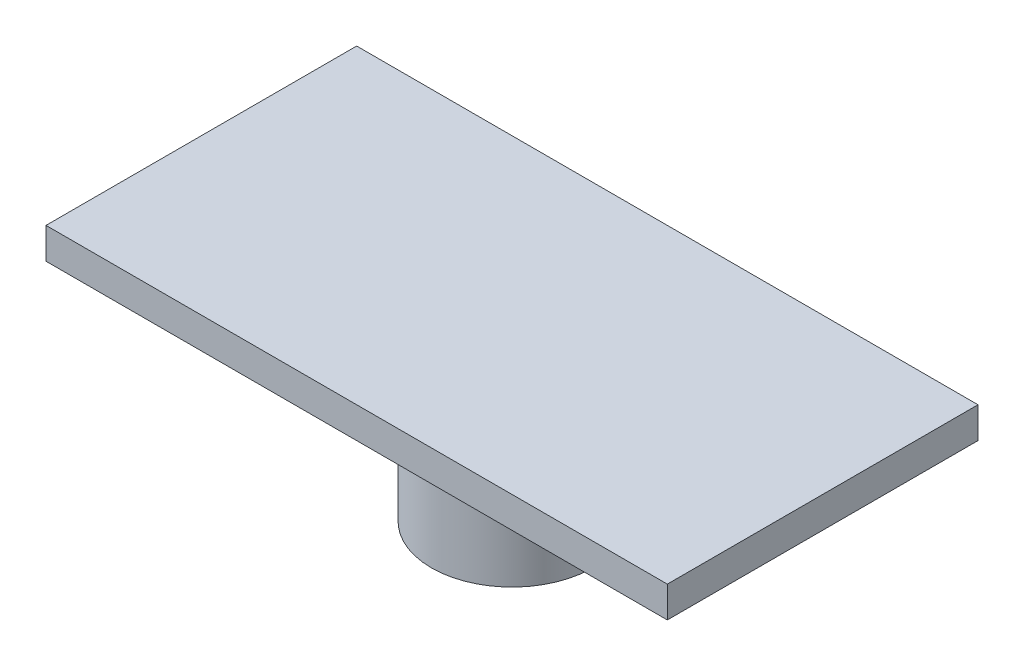
ISO-10303-21;
HEADER;
FILE_DESCRIPTION(('STEP AP214'),'2;1');
FILE_NAME('part.step','',(''),(''),'','','');
FILE_SCHEMA(('AUTOMOTIVE_DESIGN { 1 0 10303 214 1 1 1 1 }'));
ENDSEC;
DATA;
#1=APPLICATION_CONTEXT('core data for automotive mechanical design processes');
#2=APPLICATION_PROTOCOL_DEFINITION('international standard','automotive_design',2000,#1);
#3=PRODUCT_CONTEXT('',#1,'mechanical');
#4=PRODUCT('Part','Part','',(#3));
#5=PRODUCT_RELATED_PRODUCT_CATEGORY('part','',(#4));
#6=PRODUCT_DEFINITION_FORMATION('','',#4);
#7=PRODUCT_DEFINITION_CONTEXT('part definition',#1,'design');
#8=PRODUCT_DEFINITION('design','',#6,#7);
#9=PRODUCT_DEFINITION_SHAPE('','',#8);
#10=(LENGTH_UNIT() NAMED_UNIT(*) SI_UNIT(.MILLI.,.METRE.));
#11=(NAMED_UNIT(*) PLANE_ANGLE_UNIT() SI_UNIT($,.RADIAN.));
#12=(NAMED_UNIT(*) SI_UNIT($,.STERADIAN.) SOLID_ANGLE_UNIT());
#13=UNCERTAINTY_MEASURE_WITH_UNIT(LENGTH_MEASURE(1.E-05),#10,'distance_accuracy_value','');
#14=(GEOMETRIC_REPRESENTATION_CONTEXT(3) GLOBAL_UNCERTAINTY_ASSIGNED_CONTEXT((#13)) GLOBAL_UNIT_ASSIGNED_CONTEXT((#10,
#11,#12)) REPRESENTATION_CONTEXT('',''));
#15=CARTESIAN_POINT('',(0.,0.,0.));
#16=DIRECTION('',(0.,0.,1.));
#17=DIRECTION('',(1.,0.,0.));
#18=AXIS2_PLACEMENT_3D('',#15,#16,#17);
#19=CARTESIAN_POINT('',(0.,9.5,0.));
#20=DIRECTION('',(0.,-1.,0.));
#21=DIRECTION('',(0.,0.,-1.));
#22=AXIS2_PLACEMENT_3D('',#19,#20,#21);
#23=CYLINDRICAL_SURFACE('',#22,5.1893320000508);
#24=CARTESIAN_POINT('',(0.,9.5,0.));
#25=DIRECTION('',(0.,1.,0.));
#26=DIRECTION('',(0.,0.,1.));
#27=AXIS2_PLACEMENT_3D('',#24,#25,#26);
#28=CIRCLE('',#27,5.1893320000508);
#29=CARTESIAN_POINT('',(0.,9.5,5.1893320000508));
#30=VERTEX_POINT('',#29);
#31=EDGE_CURVE('E170',#30,#30,#28,.T.);
#32=ORIENTED_EDGE('',*,*,#31,.F.);
#33=EDGE_LOOP('',(#32));
#34=FACE_BOUND('',#33,.T.);
#35=CARTESIAN_POINT('',(0.,0.,0.));
#36=DIRECTION('',(0.,1.,0.));
#37=DIRECTION('',(0.,0.,1.));
#38=AXIS2_PLACEMENT_3D('',#35,#36,#37);
#39=CIRCLE('',#38,5.1893320000508);
#40=CARTESIAN_POINT('',(0.,0.,5.1893320000508));
#41=VERTEX_POINT('',#40);
#42=EDGE_CURVE('E160',#41,#41,#39,.T.);
#43=ORIENTED_EDGE('',*,*,#42,.T.);
#44=EDGE_LOOP('',(#43));
#45=FACE_BOUND('',#44,.T.);
#46=ADVANCED_FACE('F43',(#34,#45),#23,.T.);
#47=CARTESIAN_POINT('',(0.,0.,0.));
#48=DIRECTION('',(0.,1.,0.));
#49=DIRECTION('',(0.,0.,1.));
#50=AXIS2_PLACEMENT_3D('',#47,#48,#49);
#51=PLANE('',#50);
#52=CARTESIAN_POINT('',(0.874999999999995,0.,0.));
#53=DIRECTION('',(0.,1.,0.));
#54=DIRECTION('',(0.,0.,1.));
#55=AXIS2_PLACEMENT_3D('',#52,#53,#54);
#56=CIRCLE('',#55,2.29809703885628);
#57=CARTESIAN_POINT('',(2.5,0.,-1.625));
#58=VERTEX_POINT('',#57);
#59=CARTESIAN_POINT('',(2.5,0.,1.625));
#60=VERTEX_POINT('',#59);
#61=EDGE_CURVE('E51',#58,#60,#56,.F.);
#62=ORIENTED_EDGE('',*,*,#61,.F.);
#63=DIRECTION('',(-1.,0.,0.));
#64=VECTOR('',#63,1.);
#65=CARTESIAN_POINT('',(0.,0.,-1.625));
#66=LINE('',#65,#64);
#67=CARTESIAN_POINT('',(-2.5,0.,-1.625));
#68=VERTEX_POINT('',#67);
#69=EDGE_CURVE('E11',#58,#68,#66,.T.);
#70=ORIENTED_EDGE('',*,*,#69,.T.);
#71=CARTESIAN_POINT('',(-0.874999999999836,0.,0.));
#72=DIRECTION('',(0.,1.,0.));
#73=DIRECTION('',(0.,0.,1.));
#74=AXIS2_PLACEMENT_3D('',#71,#72,#73);
#75=CIRCLE('',#74,2.2980970388564);
#76=CARTESIAN_POINT('',(-2.5,0.,1.625));
#77=VERTEX_POINT('',#76);
#78=EDGE_CURVE('E174',#68,#77,#75,.T.);
#79=ORIENTED_EDGE('',*,*,#78,.T.);
#80=DIRECTION('',(-1.,0.,0.));
#81=VECTOR('',#80,1.);
#82=CARTESIAN_POINT('',(0.,0.,1.625));
#83=LINE('',#82,#81);
#84=EDGE_CURVE('E181',#60,#77,#83,.T.);
#85=ORIENTED_EDGE('',*,*,#84,.F.);
#86=EDGE_LOOP('',(#62,#70,#79,#85));
#87=FACE_BOUND('',#86,.T.);
#88=ORIENTED_EDGE('',*,*,#42,.F.);
#89=EDGE_LOOP('',(#88));
#90=FACE_BOUND('',#89,.T.);
#91=ADVANCED_FACE('F194',(#87,#90),#51,.F.);
#92=CARTESIAN_POINT('',(0.,-2.3,-1.625));
#93=DIRECTION('',(0.,0.,-1.));
#94=DIRECTION('',(-1.,0.,0.));
#95=AXIS2_PLACEMENT_3D('',#92,#93,#94);
#96=PLANE('',#95);
#97=DIRECTION('',(0.,1.,0.));
#98=VECTOR('',#97,1.);
#99=CARTESIAN_POINT('',(2.5,-2.3,-1.625));
#100=LINE('',#99,#98);
#101=CARTESIAN_POINT('',(2.5,9.5,-1.625));
#102=VERTEX_POINT('',#101);
#103=EDGE_CURVE('E157',#58,#102,#100,.T.);
#104=ORIENTED_EDGE('',*,*,#103,.T.);
#105=DIRECTION('',(-1.,0.,0.));
#106=VECTOR('',#105,1.);
#107=CARTESIAN_POINT('',(0.,9.5,-1.625));
#108=LINE('',#107,#106);
#109=CARTESIAN_POINT('',(-2.5,9.5,-1.625));
#110=VERTEX_POINT('',#109);
#111=EDGE_CURVE('E137',#102,#110,#108,.T.);
#112=ORIENTED_EDGE('',*,*,#111,.T.);
#113=DIRECTION('',(0.,1.,0.));
#114=VECTOR('',#113,1.);
#115=CARTESIAN_POINT('',(-2.5,-2.3,-1.625));
#116=LINE('',#115,#114);
#117=EDGE_CURVE('E156',#68,#110,#116,.T.);
#118=ORIENTED_EDGE('',*,*,#117,.F.);
#119=ORIENTED_EDGE('',*,*,#69,.F.);
#120=EDGE_LOOP('',(#104,#112,#118,#119));
#121=FACE_BOUND('',#120,.T.);
#122=ADVANCED_FACE('F197',(#121),#96,.F.);
#123=CARTESIAN_POINT('',(0.874999999999995,-2.3,0.));
#124=DIRECTION('',(0.,1.,0.));
#125=DIRECTION('',(0.,0.,1.));
#126=AXIS2_PLACEMENT_3D('',#123,#124,#125);
#127=CYLINDRICAL_SURFACE('',#126,2.29809703885628);
#128=ORIENTED_EDGE('',*,*,#61,.T.);
#129=DIRECTION('',(0.,1.,0.));
#130=VECTOR('',#129,1.);
#131=CARTESIAN_POINT('',(2.5,-2.3,1.625));
#132=LINE('',#131,#130);
#133=CARTESIAN_POINT('',(2.5,9.5,1.625));
#134=VERTEX_POINT('',#133);
#135=EDGE_CURVE('E161',#60,#134,#132,.T.);
#136=ORIENTED_EDGE('',*,*,#135,.T.);
#137=CARTESIAN_POINT('',(0.874999999999995,9.5,0.));
#138=DIRECTION('',(0.,1.,0.));
#139=DIRECTION('',(0.,0.,1.));
#140=AXIS2_PLACEMENT_3D('',#137,#138,#139);
#141=CIRCLE('',#140,2.29809703885628);
#142=EDGE_CURVE('E153',#102,#134,#141,.F.);
#143=ORIENTED_EDGE('',*,*,#142,.F.);
#144=ORIENTED_EDGE('',*,*,#103,.F.);
#145=EDGE_LOOP('',(#128,#136,#143,#144));
#146=FACE_BOUND('',#145,.T.);
#147=ADVANCED_FACE('F187',(#146),#127,.F.);
#148=CARTESIAN_POINT('',(0.,-2.3,1.625));
#149=DIRECTION('',(0.,0.,-1.));
#150=DIRECTION('',(-1.,0.,0.));
#151=AXIS2_PLACEMENT_3D('',#148,#149,#150);
#152=PLANE('',#151);
#153=ORIENTED_EDGE('',*,*,#84,.T.);
#154=DIRECTION('',(0.,1.,0.));
#155=VECTOR('',#154,1.);
#156=CARTESIAN_POINT('',(-2.5,-2.3,1.625));
#157=LINE('',#156,#155);
#158=CARTESIAN_POINT('',(-2.5,9.5,1.625));
#159=VERTEX_POINT('',#158);
#160=EDGE_CURVE('E58',#77,#159,#157,.T.);
#161=ORIENTED_EDGE('',*,*,#160,.T.);
#162=DIRECTION('',(-1.,0.,0.));
#163=VECTOR('',#162,1.);
#164=CARTESIAN_POINT('',(0.,9.5,1.625));
#165=LINE('',#164,#163);
#166=EDGE_CURVE('E150',#134,#159,#165,.T.);
#167=ORIENTED_EDGE('',*,*,#166,.F.);
#168=ORIENTED_EDGE('',*,*,#135,.F.);
#169=EDGE_LOOP('',(#153,#161,#167,#168));
#170=FACE_BOUND('',#169,.T.);
#171=ADVANCED_FACE('F193',(#170),#152,.T.);
#172=CARTESIAN_POINT('',(-0.874999999999836,-2.3,0.));
#173=DIRECTION('',(0.,1.,0.));
#174=DIRECTION('',(0.,0.,1.));
#175=AXIS2_PLACEMENT_3D('',#172,#173,#174);
#176=CYLINDRICAL_SURFACE('',#175,2.2980970388564);
#177=ORIENTED_EDGE('',*,*,#117,.T.);
#178=CARTESIAN_POINT('',(-0.874999999999836,9.5,0.));
#179=DIRECTION('',(0.,1.,0.));
#180=DIRECTION('',(0.,0.,1.));
#181=AXIS2_PLACEMENT_3D('',#178,#179,#180);
#182=CIRCLE('',#181,2.2980970388564);
#183=EDGE_CURVE('E142',#110,#159,#182,.T.);
#184=ORIENTED_EDGE('',*,*,#183,.T.);
#185=ORIENTED_EDGE('',*,*,#160,.F.);
#186=ORIENTED_EDGE('',*,*,#78,.F.);
#187=EDGE_LOOP('',(#177,#184,#185,#186));
#188=FACE_BOUND('',#187,.T.);
#189=ADVANCED_FACE('F196',(#188),#176,.F.);
#190=CARTESIAN_POINT('',(0.,9.5,0.));
#191=DIRECTION('',(0.,1.,0.));
#192=DIRECTION('',(0.,0.,1.));
#193=AXIS2_PLACEMENT_3D('',#190,#191,#192);
#194=PLANE('',#193);
#195=ORIENTED_EDGE('',*,*,#31,.T.);
#196=EDGE_LOOP('',(#195));
#197=FACE_BOUND('',#196,.T.);
#198=DIRECTION('',(0.,0.,-1.));
#199=VECTOR('',#198,1.);
#200=CARTESIAN_POINT('',(20.,9.5,-10.));
#201=LINE('',#200,#199);
#202=CARTESIAN_POINT('',(20.,9.5,10.));
#203=VERTEX_POINT('',#202);
#204=CARTESIAN_POINT('',(20.,9.5,-10.));
#205=VERTEX_POINT('',#204);
#206=EDGE_CURVE('E135',#203,#205,#201,.T.);
#207=ORIENTED_EDGE('',*,*,#206,.F.);
#208=DIRECTION('',(1.,0.,0.));
#209=VECTOR('',#208,1.);
#210=CARTESIAN_POINT('',(-20.,9.5,10.));
#211=LINE('',#210,#209);
#212=CARTESIAN_POINT('',(-20.,9.5,10.));
#213=VERTEX_POINT('',#212);
#214=EDGE_CURVE('E131',#213,#203,#211,.T.);
#215=ORIENTED_EDGE('',*,*,#214,.F.);
#216=DIRECTION('',(0.,0.,1.));
#217=VECTOR('',#216,1.);
#218=CARTESIAN_POINT('',(-20.,9.5,-10.));
#219=LINE('',#218,#217);
#220=CARTESIAN_POINT('',(-20.,9.5,-10.));
#221=VERTEX_POINT('',#220);
#222=EDGE_CURVE('E226',#221,#213,#219,.T.);
#223=ORIENTED_EDGE('',*,*,#222,.F.);
#224=DIRECTION('',(-1.,0.,0.));
#225=VECTOR('',#224,1.);
#226=CARTESIAN_POINT('',(-20.,9.5,-10.));
#227=LINE('',#226,#225);
#228=EDGE_CURVE('E222',#205,#221,#227,.T.);
#229=ORIENTED_EDGE('',*,*,#228,.F.);
#230=EDGE_LOOP('',(#207,#215,#223,#229));
#231=FACE_BOUND('',#230,.T.);
#232=ADVANCED_FACE('F202',(#197,#231),#194,.F.);
#233=CARTESIAN_POINT('',(0.,11.5,0.));
#234=DIRECTION('',(0.,1.,0.));
#235=DIRECTION('',(0.,0.,1.));
#236=AXIS2_PLACEMENT_3D('',#233,#234,#235);
#237=PLANE('',#236);
#238=DIRECTION('',(0.,0.,-1.));
#239=VECTOR('',#238,1.);
#240=CARTESIAN_POINT('',(20.,11.5,-10.));
#241=LINE('',#240,#239);
#242=CARTESIAN_POINT('',(20.,11.5,10.));
#243=VERTEX_POINT('',#242);
#244=CARTESIAN_POINT('',(20.,11.5,-10.));
#245=VERTEX_POINT('',#244);
#246=EDGE_CURVE('E121',#243,#245,#241,.T.);
#247=ORIENTED_EDGE('',*,*,#246,.T.);
#248=DIRECTION('',(-1.,0.,0.));
#249=VECTOR('',#248,1.);
#250=CARTESIAN_POINT('',(-20.,11.5,-10.));
#251=LINE('',#250,#249);
#252=CARTESIAN_POINT('',(-20.,11.5,-10.));
#253=VERTEX_POINT('',#252);
#254=EDGE_CURVE('E109',#245,#253,#251,.T.);
#255=ORIENTED_EDGE('',*,*,#254,.T.);
#256=DIRECTION('',(0.,0.,1.));
#257=VECTOR('',#256,1.);
#258=CARTESIAN_POINT('',(-20.,11.5,-10.));
#259=LINE('',#258,#257);
#260=CARTESIAN_POINT('',(-20.,11.5,10.));
#261=VERTEX_POINT('',#260);
#262=EDGE_CURVE('E120',#253,#261,#259,.T.);
#263=ORIENTED_EDGE('',*,*,#262,.T.);
#264=DIRECTION('',(1.,0.,0.));
#265=VECTOR('',#264,1.);
#266=CARTESIAN_POINT('',(-20.,11.5,10.));
#267=LINE('',#266,#265);
#268=EDGE_CURVE('E126',#261,#243,#267,.T.);
#269=ORIENTED_EDGE('',*,*,#268,.T.);
#270=EDGE_LOOP('',(#247,#255,#263,#269));
#271=FACE_BOUND('',#270,.T.);
#272=ADVANCED_FACE('F124',(#271),#237,.T.);
#273=CARTESIAN_POINT('',(-20.,11.5,10.));
#274=DIRECTION('',(0.,0.,-1.));
#275=DIRECTION('',(-1.,0.,0.));
#276=AXIS2_PLACEMENT_3D('',#273,#274,#275);
#277=PLANE('',#276);
#278=ORIENTED_EDGE('',*,*,#214,.T.);
#279=DIRECTION('',(0.,-1.,0.));
#280=VECTOR('',#279,1.);
#281=CARTESIAN_POINT('',(20.,11.5,10.));
#282=LINE('',#281,#280);
#283=EDGE_CURVE('E235',#243,#203,#282,.T.);
#284=ORIENTED_EDGE('',*,*,#283,.F.);
#285=ORIENTED_EDGE('',*,*,#268,.F.);
#286=DIRECTION('',(0.,-1.,0.));
#287=VECTOR('',#286,1.);
#288=CARTESIAN_POINT('',(-20.,11.5,10.));
#289=LINE('',#288,#287);
#290=EDGE_CURVE('E144',#261,#213,#289,.T.);
#291=ORIENTED_EDGE('',*,*,#290,.T.);
#292=EDGE_LOOP('',(#278,#284,#285,#291));
#293=FACE_BOUND('',#292,.T.);
#294=ADVANCED_FACE('F241',(#293),#277,.F.);
#295=CARTESIAN_POINT('',(-20.,11.5,-10.));
#296=DIRECTION('',(1.,0.,0.));
#297=DIRECTION('',(0.,0.,-1.));
#298=AXIS2_PLACEMENT_3D('',#295,#296,#297);
#299=PLANE('',#298);
#300=ORIENTED_EDGE('',*,*,#222,.T.);
#301=ORIENTED_EDGE('',*,*,#290,.F.);
#302=ORIENTED_EDGE('',*,*,#262,.F.);
#303=DIRECTION('',(0.,-1.,0.));
#304=VECTOR('',#303,1.);
#305=CARTESIAN_POINT('',(-20.,11.5,-10.));
#306=LINE('',#305,#304);
#307=EDGE_CURVE('E116',#253,#221,#306,.T.);
#308=ORIENTED_EDGE('',*,*,#307,.T.);
#309=EDGE_LOOP('',(#300,#301,#302,#308));
#310=FACE_BOUND('',#309,.T.);
#311=ADVANCED_FACE('F243',(#310),#299,.F.);
#312=CARTESIAN_POINT('',(-20.,11.5,-10.));
#313=DIRECTION('',(0.,0.,1.));
#314=DIRECTION('',(1.,0.,0.));
#315=AXIS2_PLACEMENT_3D('',#312,#313,#314);
#316=PLANE('',#315);
#317=ORIENTED_EDGE('',*,*,#228,.T.);
#318=ORIENTED_EDGE('',*,*,#307,.F.);
#319=ORIENTED_EDGE('',*,*,#254,.F.);
#320=DIRECTION('',(0.,-1.,0.));
#321=VECTOR('',#320,1.);
#322=CARTESIAN_POINT('',(20.,11.5,-10.));
#323=LINE('',#322,#321);
#324=EDGE_CURVE('E113',#245,#205,#323,.T.);
#325=ORIENTED_EDGE('',*,*,#324,.T.);
#326=EDGE_LOOP('',(#317,#318,#319,#325));
#327=FACE_BOUND('',#326,.T.);
#328=ADVANCED_FACE('F111',(#327),#316,.F.);
#329=CARTESIAN_POINT('',(20.,11.5,-10.));
#330=DIRECTION('',(-1.,0.,0.));
#331=DIRECTION('',(0.,0.,1.));
#332=AXIS2_PLACEMENT_3D('',#329,#330,#331);
#333=PLANE('',#332);
#334=ORIENTED_EDGE('',*,*,#206,.T.);
#335=ORIENTED_EDGE('',*,*,#324,.F.);
#336=ORIENTED_EDGE('',*,*,#246,.F.);
#337=ORIENTED_EDGE('',*,*,#283,.T.);
#338=EDGE_LOOP('',(#334,#335,#336,#337));
#339=FACE_BOUND('',#338,.T.);
#340=ADVANCED_FACE('F133',(#339),#333,.F.);
#341=ORIENTED_EDGE('',*,*,#111,.F.);
#342=ORIENTED_EDGE('',*,*,#142,.T.);
#343=ORIENTED_EDGE('',*,*,#166,.T.);
#344=ORIENTED_EDGE('',*,*,#183,.F.);
#345=EDGE_LOOP('',(#341,#342,#343,#344));
#346=FACE_BOUND('',#345,.T.);
#347=ADVANCED_FACE('F199',(#346),#194,.F.);
#348=CLOSED_SHELL('',(#46,#91,#122,#147,#171,#189,#232,#272,#294,#311,#328,#340,#347));
#349=MANIFOLD_SOLID_BREP('B2',#348);
#350=ADVANCED_BREP_SHAPE_REPRESENTATION('',(#18,#349),#14);
#351=SHAPE_DEFINITION_REPRESENTATION(#9,#350);
ENDSEC;
END-ISO-10303-21;
